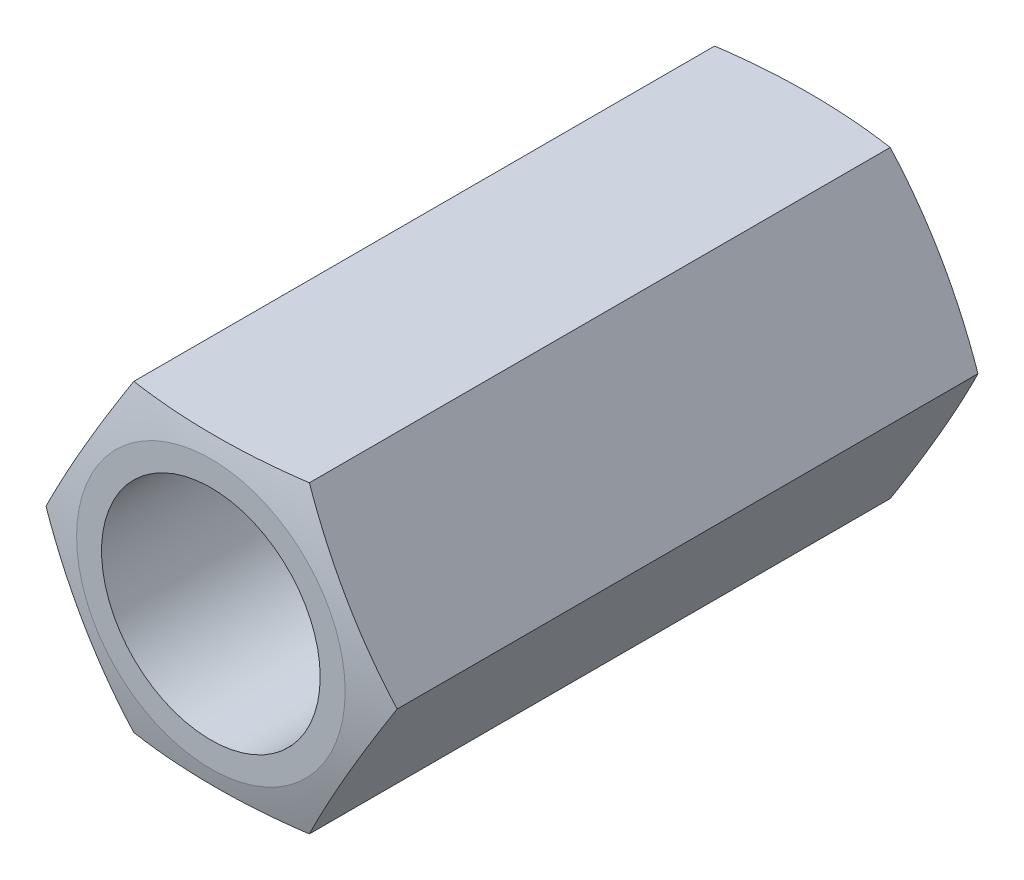
ISO-10303-21;
HEADER;
FILE_DESCRIPTION(('STEP AP214'),'2;1');
FILE_NAME('part.step','',(''),(''),'','','');
FILE_SCHEMA(('AUTOMOTIVE_DESIGN { 1 0 10303 214 1 1 1 1 }'));
ENDSEC;
DATA;
#1=APPLICATION_CONTEXT('core data for automotive mechanical design processes');
#2=APPLICATION_PROTOCOL_DEFINITION('international standard','automotive_design',2000,#1);
#3=PRODUCT_CONTEXT('',#1,'mechanical');
#4=PRODUCT('Part','Part','',(#3));
#5=PRODUCT_RELATED_PRODUCT_CATEGORY('part','',(#4));
#6=PRODUCT_DEFINITION_FORMATION('','',#4);
#7=PRODUCT_DEFINITION_CONTEXT('part definition',#1,'design');
#8=PRODUCT_DEFINITION('design','',#6,#7);
#9=PRODUCT_DEFINITION_SHAPE('','',#8);
#10=(LENGTH_UNIT() NAMED_UNIT(*) SI_UNIT(.MILLI.,.METRE.));
#11=(NAMED_UNIT(*) PLANE_ANGLE_UNIT() SI_UNIT($,.RADIAN.));
#12=(NAMED_UNIT(*) SI_UNIT($,.STERADIAN.) SOLID_ANGLE_UNIT());
#13=UNCERTAINTY_MEASURE_WITH_UNIT(LENGTH_MEASURE(1.E-05),#10,'distance_accuracy_value','');
#14=(GEOMETRIC_REPRESENTATION_CONTEXT(3) GLOBAL_UNCERTAINTY_ASSIGNED_CONTEXT((#13)) GLOBAL_UNIT_ASSIGNED_CONTEXT((#10,
#11,#12)) REPRESENTATION_CONTEXT('',''));
#15=CARTESIAN_POINT('',(0.,0.,0.));
#16=DIRECTION('',(0.,0.,1.));
#17=DIRECTION('',(1.,0.,0.));
#18=AXIS2_PLACEMENT_3D('',#15,#16,#17);
#19=CARTESIAN_POINT('',(0.,0.,25.4));
#20=DIRECTION('',(0.,0.,1.));
#21=DIRECTION('',(1.,0.,0.));
#22=AXIS2_PLACEMENT_3D('',#19,#20,#21);
#23=PLANE('',#22);
#24=CARTESIAN_POINT('',(0.,0.,25.4));
#25=DIRECTION('',(0.,0.,1.));
#26=DIRECTION('',(1.,0.,0.));
#27=AXIS2_PLACEMENT_3D('',#24,#25,#26);
#28=CIRCLE('',#27,4.6101);
#29=CARTESIAN_POINT('',(4.6101,0.,25.4));
#30=VERTEX_POINT('',#29);
#31=EDGE_CURVE('E124',#30,#30,#28,.T.);
#32=ORIENTED_EDGE('',*,*,#31,.F.);
#33=EDGE_LOOP('',(#32));
#34=FACE_BOUND('',#33,.T.);
#35=CARTESIAN_POINT('',(0.,0.,25.4));
#36=DIRECTION('',(0.,0.,1.));
#37=DIRECTION('',(1.,0.,0.));
#38=AXIS2_PLACEMENT_3D('',#35,#36,#37);
#39=CIRCLE('',#38,5.66274758697753);
#40=CARTESIAN_POINT('',(5.66274758697753,0.,25.4));
#41=VERTEX_POINT('',#40);
#42=EDGE_CURVE('E129',#41,#41,#39,.T.);
#43=ORIENTED_EDGE('',*,*,#42,.T.);
#44=EDGE_LOOP('',(#43));
#45=FACE_BOUND('',#44,.T.);
#46=ADVANCED_FACE('F33',(#34,#45),#23,.T.);
#47=CARTESIAN_POINT('',(0.,0.,0.));
#48=DIRECTION('',(0.,0.,1.));
#49=DIRECTION('',(1.,0.,0.));
#50=AXIS2_PLACEMENT_3D('',#47,#48,#49);
#51=PLANE('',#50);
#52=CARTESIAN_POINT('',(0.,0.,0.));
#53=DIRECTION('',(0.,0.,1.));
#54=DIRECTION('',(1.,0.,0.));
#55=AXIS2_PLACEMENT_3D('',#52,#53,#54);
#56=CIRCLE('',#55,3.8989);
#57=CARTESIAN_POINT('',(3.8989,0.,0.));
#58=VERTEX_POINT('',#57);
#59=EDGE_CURVE('E106',#58,#58,#56,.T.);
#60=ORIENTED_EDGE('',*,*,#59,.T.);
#61=EDGE_LOOP('',(#60));
#62=FACE_BOUND('',#61,.T.);
#63=CARTESIAN_POINT('',(0.,0.,0.));
#64=DIRECTION('',(0.,0.,1.));
#65=DIRECTION('',(1.,0.,0.));
#66=AXIS2_PLACEMENT_3D('',#63,#64,#65);
#67=CIRCLE('',#66,5.66274758697753);
#68=CARTESIAN_POINT('',(5.66274758697753,0.,0.));
#69=VERTEX_POINT('',#68);
#70=EDGE_CURVE('E143',#69,#69,#67,.T.);
#71=ORIENTED_EDGE('',*,*,#70,.F.);
#72=EDGE_LOOP('',(#71));
#73=FACE_BOUND('',#72,.T.);
#74=ADVANCED_FACE('F173',(#62,#73),#51,.F.);
#75=CARTESIAN_POINT('',(0.,0.,25.4));
#76=DIRECTION('',(0.,0.,-1.));
#77=DIRECTION('',(-1.,0.,0.));
#78=AXIS2_PLACEMENT_3D('',#75,#76,#77);
#79=CYLINDRICAL_SURFACE('',#78,3.8989);
#80=ORIENTED_EDGE('',*,*,#59,.F.);
#81=EDGE_LOOP('',(#80));
#82=FACE_BOUND('',#81,.T.);
#83=CARTESIAN_POINT('',(0.,0.,9.525));
#84=DIRECTION('',(0.,0.,1.));
#85=DIRECTION('',(1.,0.,0.));
#86=AXIS2_PLACEMENT_3D('',#83,#84,#85);
#87=CIRCLE('',#86,3.8989);
#88=CARTESIAN_POINT('',(3.8989,0.,9.525));
#89=VERTEX_POINT('',#88);
#90=EDGE_CURVE('E117',#89,#89,#87,.T.);
#91=ORIENTED_EDGE('',*,*,#90,.T.);
#92=EDGE_LOOP('',(#91));
#93=FACE_BOUND('',#92,.T.);
#94=ADVANCED_FACE('F179',(#82,#93),#79,.F.);
#95=CARTESIAN_POINT('',(0.,0.,9.525));
#96=DIRECTION('',(0.,0.,1.));
#97=DIRECTION('',(1.,0.,0.));
#98=AXIS2_PLACEMENT_3D('',#95,#96,#97);
#99=CYLINDRICAL_SURFACE('',#98,4.6101);
#100=CARTESIAN_POINT('',(0.,0.,9.525));
#101=DIRECTION('',(0.,0.,1.));
#102=DIRECTION('',(1.,0.,0.));
#103=AXIS2_PLACEMENT_3D('',#100,#101,#102);
#104=CIRCLE('',#103,4.6101);
#105=CARTESIAN_POINT('',(4.6101,0.,9.525));
#106=VERTEX_POINT('',#105);
#107=EDGE_CURVE('E119',#106,#106,#104,.T.);
#108=ORIENTED_EDGE('',*,*,#107,.F.);
#109=EDGE_LOOP('',(#108));
#110=FACE_BOUND('',#109,.T.);
#111=ORIENTED_EDGE('',*,*,#31,.T.);
#112=EDGE_LOOP('',(#111));
#113=FACE_BOUND('',#112,.T.);
#114=ADVANCED_FACE('F260',(#110,#113),#99,.F.);
#115=CARTESIAN_POINT('',(0.,0.,9.525));
#116=DIRECTION('',(0.,0.,1.));
#117=DIRECTION('',(1.,0.,0.));
#118=AXIS2_PLACEMENT_3D('',#115,#116,#117);
#119=PLANE('',#118);
#120=ORIENTED_EDGE('',*,*,#90,.F.);
#121=EDGE_LOOP('',(#120));
#122=FACE_BOUND('',#121,.T.);
#123=ORIENTED_EDGE('',*,*,#107,.T.);
#124=EDGE_LOOP('',(#123));
#125=FACE_BOUND('',#124,.T.);
#126=ADVANCED_FACE('F226',(#122,#125),#119,.T.);
#127=CARTESIAN_POINT('',(0.,0.,25.4));
#128=DIRECTION('',(0.,0.,1.));
#129=DIRECTION('',(0.,1.,0.));
#130=AXIS2_PLACEMENT_3D('',#127,#128,#129);
#131=SPHERICAL_SURFACE('',#130,26.0235798888973);
#132=CARTESIAN_POINT('',(5.55425392717149,-3.20675000000001,25.4));
#133=DIRECTION('',(-0.866025403784442,0.499999999999995,0.));
#134=DIRECTION('',(-0.499999999999995,-0.866025403784442,0.));
#135=AXIS2_PLACEMENT_3D('',#132,#133,#134);
#136=CIRCLE('',#135,25.2208986355328);
#137=CARTESIAN_POINT('',(7.4056719028953,0.,0.452400237688458));
#138=VERTEX_POINT('',#137);
#139=CARTESIAN_POINT('',(3.70283595144773,-6.41349999999994,0.452400237688444));
#140=VERTEX_POINT('',#139);
#141=EDGE_CURVE('E55',#138,#140,#136,.T.);
#142=ORIENTED_EDGE('',*,*,#141,.T.);
#143=CARTESIAN_POINT('',(0.,-6.41349999999997,25.4));
#144=DIRECTION('',(0.,1.,0.));
#145=DIRECTION('',(-1.,0.,0.));
#146=AXIS2_PLACEMENT_3D('',#143,#144,#145);
#147=CIRCLE('',#146,25.2208986355328);
#148=CARTESIAN_POINT('',(-3.70283595144759,-6.41350000000001,0.452400237688444));
#149=VERTEX_POINT('',#148);
#150=EDGE_CURVE('E41',#140,#149,#147,.T.);
#151=ORIENTED_EDGE('',*,*,#150,.T.);
#152=CARTESIAN_POINT('',(-5.55425392717143,-3.20675000000007,25.4));
#153=DIRECTION('',(0.866025403784434,0.500000000000007,0.));
#154=DIRECTION('',(-0.500000000000007,0.866025403784435,0.));
#155=AXIS2_PLACEMENT_3D('',#152,#153,#154);
#156=CIRCLE('',#155,25.2208986355328);
#157=CARTESIAN_POINT('',(-7.4056719028953,0.,0.452400237688458));
#158=VERTEX_POINT('',#157);
#159=EDGE_CURVE('E85',#149,#158,#156,.T.);
#160=ORIENTED_EDGE('',*,*,#159,.T.);
#161=CARTESIAN_POINT('',(-5.55425392717151,3.20674999999992,25.4));
#162=DIRECTION('',(0.866025403784441,-0.499999999999995,0.));
#163=DIRECTION('',(0.499999999999995,0.866025403784442,0.));
#164=AXIS2_PLACEMENT_3D('',#161,#162,#163);
#165=CIRCLE('',#164,25.2208986355328);
#166=CARTESIAN_POINT('',(-3.70283595144768,6.41349999999996,0.452400237688472));
#167=VERTEX_POINT('',#166);
#168=EDGE_CURVE('E99',#158,#167,#165,.T.);
#169=ORIENTED_EDGE('',*,*,#168,.T.);
#170=CARTESIAN_POINT('',(0.,6.41349999999997,25.4));
#171=DIRECTION('',(0.,-1.,0.));
#172=DIRECTION('',(1.,0.,0.));
#173=AXIS2_PLACEMENT_3D('',#170,#171,#172);
#174=CIRCLE('',#173,25.2208986355328);
#175=CARTESIAN_POINT('',(3.70283595144764,6.41349999999999,0.452400237688472));
#176=VERTEX_POINT('',#175);
#177=EDGE_CURVE('E149',#167,#176,#174,.T.);
#178=ORIENTED_EDGE('',*,*,#177,.T.);
#179=CARTESIAN_POINT('',(5.55425392717149,3.20674999999995,25.4));
#180=DIRECTION('',(-0.866025403784438,-0.500000000000001,0.));
#181=DIRECTION('',(0.500000000000001,-0.866025403784438,0.));
#182=AXIS2_PLACEMENT_3D('',#179,#180,#181);
#183=CIRCLE('',#182,25.2208986355328);
#184=EDGE_CURVE('E147',#176,#138,#183,.T.);
#185=ORIENTED_EDGE('',*,*,#184,.T.);
#186=EDGE_LOOP('',(#142,#151,#160,#169,#178,#185));
#187=FACE_BOUND('',#186,.T.);
#188=ORIENTED_EDGE('',*,*,#70,.T.);
#189=EDGE_LOOP('',(#188));
#190=FACE_BOUND('',#189,.T.);
#191=ADVANCED_FACE('F83',(#187,#190),#131,.T.);
#192=CARTESIAN_POINT('',(0.,0.,0.));
#193=DIRECTION('',(0.,0.,1.));
#194=DIRECTION('',(0.,1.,0.));
#195=AXIS2_PLACEMENT_3D('',#192,#193,#194);
#196=SPHERICAL_SURFACE('',#195,26.0235798888973);
#197=ORIENTED_EDGE('',*,*,#42,.F.);
#198=EDGE_LOOP('',(#197));
#199=FACE_BOUND('',#198,.T.);
#200=CARTESIAN_POINT('',(5.55425392717152,-3.20674999999997,0.));
#201=DIRECTION('',(-0.866025403784442,0.499999999999995,0.));
#202=DIRECTION('',(-0.499999999999995,-0.866025403784442,0.));
#203=AXIS2_PLACEMENT_3D('',#200,#201,#202);
#204=CIRCLE('',#203,25.2208986355328);
#205=CARTESIAN_POINT('',(3.70283595144773,-6.41349999999994,24.9475997623115));
#206=VERTEX_POINT('',#205);
#207=CARTESIAN_POINT('',(7.4056719028953,0.,24.9475997623115));
#208=VERTEX_POINT('',#207);
#209=EDGE_CURVE('E134',#206,#208,#204,.T.);
#210=ORIENTED_EDGE('',*,*,#209,.T.);
#211=CARTESIAN_POINT('',(5.55425392717147,3.20674999999999,0.));
#212=DIRECTION('',(-0.866025403784438,-0.500000000000001,0.));
#213=DIRECTION('',(0.500000000000001,-0.866025403784438,0.));
#214=AXIS2_PLACEMENT_3D('',#211,#212,#213);
#215=CIRCLE('',#214,25.2208986355328);
#216=CARTESIAN_POINT('',(3.70283595144764,6.41349999999999,24.9475997623115));
#217=VERTEX_POINT('',#216);
#218=EDGE_CURVE('E136',#208,#217,#215,.T.);
#219=ORIENTED_EDGE('',*,*,#218,.T.);
#220=CARTESIAN_POINT('',(0.,6.41349999999997,0.));
#221=DIRECTION('',(0.,-1.,0.));
#222=DIRECTION('',(1.,0.,0.));
#223=AXIS2_PLACEMENT_3D('',#220,#221,#222);
#224=CIRCLE('',#223,25.2208986355328);
#225=CARTESIAN_POINT('',(-3.70283595144768,6.41349999999996,24.9475997623115));
#226=VERTEX_POINT('',#225);
#227=EDGE_CURVE('E138',#217,#226,#224,.T.);
#228=ORIENTED_EDGE('',*,*,#227,.T.);
#229=CARTESIAN_POINT('',(-5.55425392717149,3.20674999999995,0.));
#230=DIRECTION('',(0.866025403784441,-0.499999999999995,0.));
#231=DIRECTION('',(0.499999999999995,0.866025403784442,0.));
#232=AXIS2_PLACEMENT_3D('',#229,#230,#231);
#233=CIRCLE('',#232,25.2208986355328);
#234=CARTESIAN_POINT('',(-7.4056719028953,0.,24.9475997623115));
#235=VERTEX_POINT('',#234);
#236=EDGE_CURVE('E140',#226,#235,#233,.T.);
#237=ORIENTED_EDGE('',*,*,#236,.T.);
#238=CARTESIAN_POINT('',(-5.55425392717145,-3.20675000000003,0.));
#239=DIRECTION('',(0.866025403784434,0.500000000000007,0.));
#240=DIRECTION('',(-0.500000000000007,0.866025403784435,0.));
#241=AXIS2_PLACEMENT_3D('',#238,#239,#240);
#242=CIRCLE('',#241,25.2208986355328);
#243=CARTESIAN_POINT('',(-3.70283595144759,-6.41350000000001,24.9475997623115));
#244=VERTEX_POINT('',#243);
#245=EDGE_CURVE('E47',#235,#244,#242,.T.);
#246=ORIENTED_EDGE('',*,*,#245,.T.);
#247=CARTESIAN_POINT('',(0.,-6.41349999999997,0.));
#248=DIRECTION('',(0.,1.,0.));
#249=DIRECTION('',(-1.,0.,0.));
#250=AXIS2_PLACEMENT_3D('',#247,#248,#249);
#251=CIRCLE('',#250,25.2208986355328);
#252=EDGE_CURVE('E11',#244,#206,#251,.T.);
#253=ORIENTED_EDGE('',*,*,#252,.T.);
#254=EDGE_LOOP('',(#210,#219,#228,#237,#246,#253));
#255=FACE_BOUND('',#254,.T.);
#256=ADVANCED_FACE('F161',(#199,#255),#196,.T.);
#257=CARTESIAN_POINT('',(-3.70283595144759,-6.41350000000001,25.4));
#258=DIRECTION('',(0.,1.,0.));
#259=DIRECTION('',(-1.,0.,0.));
#260=AXIS2_PLACEMENT_3D('',#257,#258,#259);
#261=PLANE('',#260);
#262=ORIENTED_EDGE('',*,*,#252,.F.);
#263=DIRECTION('',(0.,0.,-1.));
#264=VECTOR('',#263,1.);
#265=CARTESIAN_POINT('',(-3.70283595144759,-6.41350000000001,25.4));
#266=LINE('',#265,#264);
#267=EDGE_CURVE('E96',#244,#149,#266,.T.);
#268=ORIENTED_EDGE('',*,*,#267,.T.);
#269=ORIENTED_EDGE('',*,*,#150,.F.);
#270=DIRECTION('',(0.,0.,-1.));
#271=VECTOR('',#270,1.);
#272=CARTESIAN_POINT('',(3.70283595144773,-6.41349999999994,25.4));
#273=LINE('',#272,#271);
#274=EDGE_CURVE('E102',#206,#140,#273,.T.);
#275=ORIENTED_EDGE('',*,*,#274,.F.);
#276=EDGE_LOOP('',(#262,#268,#269,#275));
#277=FACE_BOUND('',#276,.T.);
#278=ADVANCED_FACE('F101',(#277),#261,.F.);
#279=CARTESIAN_POINT('',(-7.4056719028953,0.,25.4));
#280=DIRECTION('',(0.866025403784434,0.500000000000007,0.));
#281=DIRECTION('',(-0.500000000000007,0.866025403784435,0.));
#282=AXIS2_PLACEMENT_3D('',#279,#280,#281);
#283=PLANE('',#282);
#284=ORIENTED_EDGE('',*,*,#245,.F.);
#285=DIRECTION('',(0.,0.,-1.));
#286=VECTOR('',#285,1.);
#287=CARTESIAN_POINT('',(-7.4056719028953,0.,25.4));
#288=LINE('',#287,#286);
#289=EDGE_CURVE('E98',#235,#158,#288,.T.);
#290=ORIENTED_EDGE('',*,*,#289,.T.);
#291=ORIENTED_EDGE('',*,*,#159,.F.);
#292=ORIENTED_EDGE('',*,*,#267,.F.);
#293=EDGE_LOOP('',(#284,#290,#291,#292));
#294=FACE_BOUND('',#293,.T.);
#295=ADVANCED_FACE('F95',(#294),#283,.F.);
#296=CARTESIAN_POINT('',(-3.70283595144768,6.41349999999996,25.4));
#297=DIRECTION('',(0.866025403784441,-0.499999999999995,0.));
#298=DIRECTION('',(0.499999999999995,0.866025403784442,0.));
#299=AXIS2_PLACEMENT_3D('',#296,#297,#298);
#300=PLANE('',#299);
#301=ORIENTED_EDGE('',*,*,#236,.F.);
#302=DIRECTION('',(0.,0.,-1.));
#303=VECTOR('',#302,1.);
#304=CARTESIAN_POINT('',(-3.70283595144768,6.41349999999996,25.4));
#305=LINE('',#304,#303);
#306=EDGE_CURVE('E104',#226,#167,#305,.T.);
#307=ORIENTED_EDGE('',*,*,#306,.T.);
#308=ORIENTED_EDGE('',*,*,#168,.F.);
#309=ORIENTED_EDGE('',*,*,#289,.F.);
#310=EDGE_LOOP('',(#301,#307,#308,#309));
#311=FACE_BOUND('',#310,.T.);
#312=ADVANCED_FACE('F160',(#311),#300,.F.);
#313=CARTESIAN_POINT('',(3.70283595144764,6.41349999999999,25.4));
#314=DIRECTION('',(0.,-1.,0.));
#315=DIRECTION('',(1.,0.,0.));
#316=AXIS2_PLACEMENT_3D('',#313,#314,#315);
#317=PLANE('',#316);
#318=ORIENTED_EDGE('',*,*,#227,.F.);
#319=DIRECTION('',(0.,0.,-1.));
#320=VECTOR('',#319,1.);
#321=CARTESIAN_POINT('',(3.70283595144764,6.41349999999999,25.4));
#322=LINE('',#321,#320);
#323=EDGE_CURVE('E112',#217,#176,#322,.T.);
#324=ORIENTED_EDGE('',*,*,#323,.T.);
#325=ORIENTED_EDGE('',*,*,#177,.F.);
#326=ORIENTED_EDGE('',*,*,#306,.F.);
#327=EDGE_LOOP('',(#318,#324,#325,#326));
#328=FACE_BOUND('',#327,.T.);
#329=ADVANCED_FACE('F157',(#328),#317,.F.);
#330=CARTESIAN_POINT('',(7.4056719028953,0.,25.4));
#331=DIRECTION('',(-0.866025403784438,-0.500000000000001,0.));
#332=DIRECTION('',(0.500000000000001,-0.866025403784438,0.));
#333=AXIS2_PLACEMENT_3D('',#330,#331,#332);
#334=PLANE('',#333);
#335=ORIENTED_EDGE('',*,*,#218,.F.);
#336=DIRECTION('',(0.,0.,-1.));
#337=VECTOR('',#336,1.);
#338=CARTESIAN_POINT('',(7.4056719028953,0.,25.4));
#339=LINE('',#338,#337);
#340=EDGE_CURVE('E91',#208,#138,#339,.T.);
#341=ORIENTED_EDGE('',*,*,#340,.T.);
#342=ORIENTED_EDGE('',*,*,#184,.F.);
#343=ORIENTED_EDGE('',*,*,#323,.F.);
#344=EDGE_LOOP('',(#335,#341,#342,#343));
#345=FACE_BOUND('',#344,.T.);
#346=ADVANCED_FACE('F164',(#345),#334,.F.);
#347=CARTESIAN_POINT('',(3.70283595144773,-6.41349999999994,25.4));
#348=DIRECTION('',(-0.866025403784442,0.499999999999995,0.));
#349=DIRECTION('',(-0.499999999999995,-0.866025403784442,0.));
#350=AXIS2_PLACEMENT_3D('',#347,#348,#349);
#351=PLANE('',#350);
#352=ORIENTED_EDGE('',*,*,#209,.F.);
#353=ORIENTED_EDGE('',*,*,#274,.T.);
#354=ORIENTED_EDGE('',*,*,#141,.F.);
#355=ORIENTED_EDGE('',*,*,#340,.F.);
#356=EDGE_LOOP('',(#352,#353,#354,#355));
#357=FACE_BOUND('',#356,.T.);
#358=ADVANCED_FACE('F35',(#357),#351,.F.);
#359=CLOSED_SHELL('',(#46,#74,#94,#114,#126,#191,#256,#278,#295,#312,#329,#346,#358));
#360=MANIFOLD_SOLID_BREP('B2',#359);
#361=ADVANCED_BREP_SHAPE_REPRESENTATION('',(#18,#360),#14);
#362=SHAPE_DEFINITION_REPRESENTATION(#9,#361);
ENDSEC;
END-ISO-10303-21;
